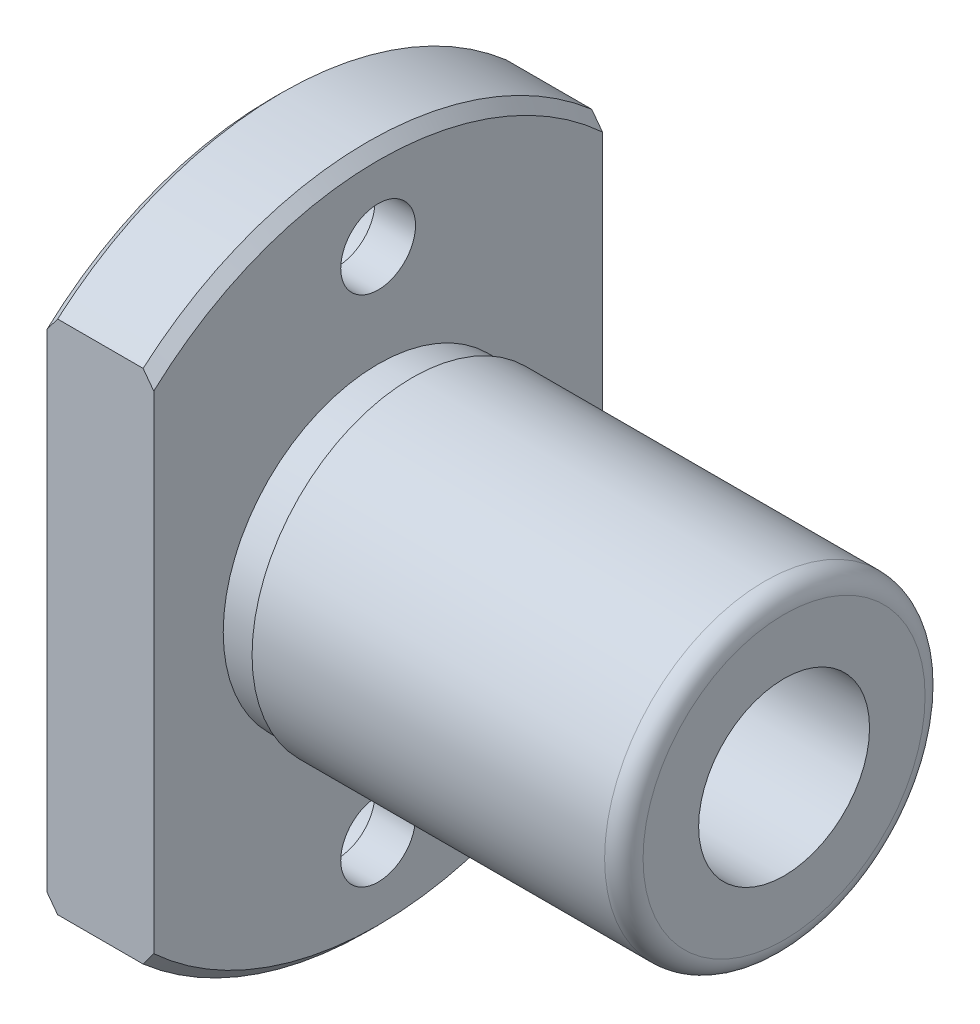
ISO-10303-21;
HEADER;
FILE_DESCRIPTION(('STEP AP214'),'2;1');
FILE_NAME('part.step','',(''),(''),'','','');
FILE_SCHEMA(('AUTOMOTIVE_DESIGN { 1 0 10303 214 1 1 1 1 }'));
ENDSEC;
DATA;
#1=APPLICATION_CONTEXT('core data for automotive mechanical design processes');
#2=APPLICATION_PROTOCOL_DEFINITION('international standard','automotive_design',2000,#1);
#3=PRODUCT_CONTEXT('',#1,'mechanical');
#4=PRODUCT('Part','Part','',(#3));
#5=PRODUCT_RELATED_PRODUCT_CATEGORY('part','',(#4));
#6=PRODUCT_DEFINITION_FORMATION('','',#4);
#7=PRODUCT_DEFINITION_CONTEXT('part definition',#1,'design');
#8=PRODUCT_DEFINITION('design','',#6,#7);
#9=PRODUCT_DEFINITION_SHAPE('','',#8);
#10=(LENGTH_UNIT() NAMED_UNIT(*) SI_UNIT(.MILLI.,.METRE.));
#11=(NAMED_UNIT(*) PLANE_ANGLE_UNIT() SI_UNIT($,.RADIAN.));
#12=(NAMED_UNIT(*) SI_UNIT($,.STERADIAN.) SOLID_ANGLE_UNIT());
#13=UNCERTAINTY_MEASURE_WITH_UNIT(LENGTH_MEASURE(1.E-05),#10,'distance_accuracy_value','');
#14=(GEOMETRIC_REPRESENTATION_CONTEXT(3) GLOBAL_UNCERTAINTY_ASSIGNED_CONTEXT((#13)) GLOBAL_UNIT_ASSIGNED_CONTEXT((#10,
#11,#12)) REPRESENTATION_CONTEXT('',''));
#15=CARTESIAN_POINT('',(0.,0.,0.));
#16=DIRECTION('',(0.,0.,1.));
#17=DIRECTION('',(1.,0.,0.));
#18=AXIS2_PLACEMENT_3D('',#15,#16,#17);
#19=CARTESIAN_POINT('',(4.50000000002017,0.,0.));
#20=DIRECTION('',(-1.,0.,0.));
#21=DIRECTION('',(0.,-0.735597048951348,-0.677419354295453));
#22=AXIS2_PLACEMENT_3D('',#19,#20,#21);
#23=CONICAL_SURFACE('',#22,15.9999999999798,0.785398163397446);
#24=CARTESIAN_POINT('',(4.99999998756977,-11.4017542678895,-10.5));
#25=CARTESIAN_POINT('',(4.83485881823746,-11.6262537644729,-10.5));
#26=CARTESIAN_POINT('',(4.66800625282314,-11.8500370074933,-10.5));
#27=CARTESIAN_POINT('',(4.50000000002689,-12.0726964676243,-10.5));
#28=B_SPLINE_CURVE_WITH_KNOTS('',3,(#24,#25,#26,#27),.UNSPECIFIED.,.F.,.F.,(4,4),(0.,1.),.UNSPECIFIED.);
#29=CARTESIAN_POINT('',(5.,-11.4017542587459,-10.4999999915795));
#30=VERTEX_POINT('',#29);
#31=CARTESIAN_POINT('',(4.50000000005547,-12.0726964675925,-10.4999999999811));
#32=VERTEX_POINT('',#31);
#33=EDGE_CURVE('E84',#30,#32,#28,.T.);
#34=ORIENTED_EDGE('',*,*,#33,.F.);
#35=CARTESIAN_POINT('',(5.,0.,0.));
#36=DIRECTION('',(-1.,0.,0.));
#37=DIRECTION('',(0.,-0.735597048951348,-0.677419354295453));
#38=AXIS2_PLACEMENT_3D('',#35,#36,#37);
#39=CIRCLE('',#38,15.5);
#40=CARTESIAN_POINT('',(5.,-11.4017542509914,10.5));
#41=VERTEX_POINT('',#40);
#42=EDGE_CURVE('E102',#41,#30,#39,.F.);
#43=ORIENTED_EDGE('',*,*,#42,.F.);
#44=CARTESIAN_POINT('',(4.50000000005551,-12.0726964675762,10.5));
#45=CARTESIAN_POINT('',(4.66801110892824,-11.8500305744023,10.5));
#46=CARTESIAN_POINT('',(4.83486331846093,-11.6262476497699,10.5));
#47=CARTESIAN_POINT('',(4.99999999999999,-11.4017542509914,10.5));
#48=B_SPLINE_CURVE_WITH_KNOTS('',3,(#44,#45,#46,#47),.UNSPECIFIED.,.F.,.F.,(4,4),(0.,1.),.UNSPECIFIED.);
#49=CARTESIAN_POINT('',(4.50000000005547,-12.0726964675762,10.4999999999999));
#50=VERTEX_POINT('',#49);
#51=EDGE_CURVE('E110',#50,#41,#48,.T.);
#52=ORIENTED_EDGE('',*,*,#51,.F.);
#53=CARTESIAN_POINT('',(4.50000000005547,0.,0.));
#54=DIRECTION('',(1.,0.,0.));
#55=DIRECTION('',(0.,-0.754543529226127,0.656250000002271));
#56=AXIS2_PLACEMENT_3D('',#53,#54,#55);
#57=CIRCLE('',#56,15.9999999999445);
#58=EDGE_CURVE('E104',#50,#32,#57,.T.);
#59=ORIENTED_EDGE('',*,*,#58,.T.);
#60=EDGE_LOOP('',(#34,#43,#52,#59));
#61=FACE_BOUND('',#60,.T.);
#62=ADVANCED_FACE('F17',(#61),#23,.T.);
#63=CARTESIAN_POINT('',(24.,0.,0.));
#64=DIRECTION('',(1.,0.,0.));
#65=DIRECTION('',(0.,-0.754543529226128,0.65625000000227));
#66=AXIS2_PLACEMENT_3D('',#63,#64,#65);
#67=CYLINDRICAL_SURFACE('',#66,16.);
#68=DIRECTION('',(1.,-2.61834998122889E-12,3.01003666430961E-12));
#69=VECTOR('',#68,1.);
#70=CARTESIAN_POINT('',(0.499999999954969,-12.0726964676239,-10.5000000000296));
#71=LINE('',#70,#69);
#72=CARTESIAN_POINT('',(0.499999999954969,-12.0726964676239,-10.5000000000296));
#73=VERTEX_POINT('',#72);
#74=EDGE_CURVE('E370',#32,#73,#71,.F.);
#75=ORIENTED_EDGE('',*,*,#74,.F.);
#76=ORIENTED_EDGE('',*,*,#58,.F.);
#77=DIRECTION('',(-1.,-7.06767977465531E-12,-8.12638845092161E-12));
#78=VECTOR('',#77,1.);
#79=CARTESIAN_POINT('',(4.50000000005551,-12.072696467618,10.5000000000363));
#80=LINE('',#79,#78);
#81=CARTESIAN_POINT('',(0.499999999994138,-12.0726964676463,10.5000000000038));
#82=VERTEX_POINT('',#81);
#83=EDGE_CURVE('E377',#50,#82,#80,.T.);
#84=ORIENTED_EDGE('',*,*,#83,.T.);
#85=CARTESIAN_POINT('',(0.499999999994138,0.,0.));
#86=DIRECTION('',(1.,0.,0.));
#87=DIRECTION('',(0.,-0.754543529227894,0.65625000000024));
#88=AXIS2_PLACEMENT_3D('',#85,#86,#87);
#89=CIRCLE('',#88,16.);
#90=EDGE_CURVE('E373',#82,#73,#89,.T.);
#91=ORIENTED_EDGE('',*,*,#90,.T.);
#92=EDGE_LOOP('',(#75,#76,#84,#91));
#93=FACE_BOUND('',#92,.T.);
#94=ADVANCED_FACE('F131',(#93),#67,.T.);
#95=CARTESIAN_POINT('',(0.499999999995601,0.,0.));
#96=DIRECTION('',(1.,0.,0.));
#97=DIRECTION('',(0.,-0.735597048951347,0.677419354295453));
#98=AXIS2_PLACEMENT_3D('',#95,#96,#97);
#99=CONICAL_SURFACE('',#98,15.9999999999956,0.785398163397449);
#100=CARTESIAN_POINT('',(0.49999999995497,-12.0726964676069,-10.5));
#101=CARTESIAN_POINT('',(0.331988891078524,-11.8500305744224,-10.5));
#102=CARTESIAN_POINT('',(0.165136681542717,-11.6262476497803,-10.5));
#103=CARTESIAN_POINT('',(0.,-11.4017542509914,-10.5));
#104=B_SPLINE_CURVE_WITH_KNOTS('',3,(#100,#101,#102,#103),.UNSPECIFIED.,.F.,.F.,(4,4),(0.,1.),.UNSPECIFIED.);
#105=CARTESIAN_POINT('',(0.,-11.4017542509914,-10.5));
#106=VERTEX_POINT('',#105);
#107=EDGE_CURVE('E361',#73,#106,#104,.T.);
#108=ORIENTED_EDGE('',*,*,#107,.F.);
#109=ORIENTED_EDGE('',*,*,#90,.F.);
#110=CARTESIAN_POINT('',(1.24302330581361E-08,-11.4017542678895,10.5));
#111=CARTESIAN_POINT('',(0.165141181769335,-11.6262537644793,10.5));
#112=CARTESIAN_POINT('',(0.331993747190985,-11.8500370075067,10.5));
#113=CARTESIAN_POINT('',(0.499999999994138,-12.0726964676441,10.5));
#114=B_SPLINE_CURVE_WITH_KNOTS('',3,(#110,#111,#112,#113),.UNSPECIFIED.,.F.,.F.,(4,4),(0.,1.),.UNSPECIFIED.);
#115=CARTESIAN_POINT('',(0.,-11.4017542587459,10.4999999915795));
#116=VERTEX_POINT('',#115);
#117=EDGE_CURVE('E163',#116,#82,#114,.T.);
#118=ORIENTED_EDGE('',*,*,#117,.F.);
#119=CARTESIAN_POINT('',(0.,0.,0.));
#120=DIRECTION('',(1.,0.,0.));
#121=DIRECTION('',(0.,-0.735597048951348,0.677419354295453));
#122=AXIS2_PLACEMENT_3D('',#119,#120,#121);
#123=CIRCLE('',#122,15.5);
#124=EDGE_CURVE('E154',#116,#106,#123,.T.);
#125=ORIENTED_EDGE('',*,*,#124,.T.);
#126=EDGE_LOOP('',(#108,#109,#118,#125));
#127=FACE_BOUND('',#126,.T.);
#128=ADVANCED_FACE('F135',(#127),#99,.T.);
#129=CARTESIAN_POINT('',(0.,-15.7406297060702,-10.5));
#130=DIRECTION('',(-1.,0.,0.));
#131=DIRECTION('',(0.,0.,1.));
#132=AXIS2_PLACEMENT_3D('',#129,#130,#131);
#133=PLANE('',#132);
#134=CARTESIAN_POINT('',(0.,0.,0.));
#135=DIRECTION('',(-1.,0.,0.));
#136=DIRECTION('',(0.,0.735597048451057,0.67741935483871));
#137=AXIS2_PLACEMENT_3D('',#134,#135,#136);
#138=CIRCLE('',#137,15.5);
#139=CARTESIAN_POINT('',(0.,11.4017542509914,-10.5));
#140=VERTEX_POINT('',#139);
#141=CARTESIAN_POINT('',(0.,11.4017542509914,10.5));
#142=VERTEX_POINT('',#141);
#143=EDGE_CURVE('E162',#140,#142,#138,.F.);
#144=ORIENTED_EDGE('',*,*,#143,.F.);
#145=DIRECTION('',(0.,-1.,0.));
#146=VECTOR('',#145,1.);
#147=CARTESIAN_POINT('',(0.,11.4017542509914,-10.5));
#148=LINE('',#147,#146);
#149=EDGE_CURVE('E168',#106,#140,#148,.F.);
#150=ORIENTED_EDGE('',*,*,#149,.F.);
#151=ORIENTED_EDGE('',*,*,#124,.F.);
#152=DIRECTION('',(0.,1.,0.));
#153=VECTOR('',#152,1.);
#154=CARTESIAN_POINT('',(0.,-11.4017542678895,10.5));
#155=LINE('',#154,#153);
#156=EDGE_CURVE('E172',#142,#116,#155,.F.);
#157=ORIENTED_EDGE('',*,*,#156,.F.);
#158=EDGE_LOOP('',(#144,#150,#151,#157));
#159=FACE_BOUND('',#158,.T.);
#160=CARTESIAN_POINT('',(0.,0.,0.));
#161=DIRECTION('',(1.,0.,0.));
#162=DIRECTION('',(0.,0.,1.));
#163=AXIS2_PLACEMENT_3D('',#160,#161,#162);
#164=CIRCLE('',#163,4.);
#165=CARTESIAN_POINT('',(0.,0.,4.));
#166=VERTEX_POINT('',#165);
#167=EDGE_CURVE('E176',#166,#166,#164,.T.);
#168=ORIENTED_EDGE('',*,*,#167,.T.);
#169=EDGE_LOOP('',(#168));
#170=FACE_BOUND('',#169,.T.);
#171=CARTESIAN_POINT('',(0.,-12.,0.));
#172=DIRECTION('',(1.,0.,0.));
#173=DIRECTION('',(0.,0.,1.));
#174=AXIS2_PLACEMENT_3D('',#171,#172,#173);
#175=CIRCLE('',#174,3.);
#176=CARTESIAN_POINT('',(0.,-12.,3.));
#177=VERTEX_POINT('',#176);
#178=EDGE_CURVE('E181',#177,#177,#175,.T.);
#179=ORIENTED_EDGE('',*,*,#178,.T.);
#180=EDGE_LOOP('',(#179));
#181=FACE_BOUND('',#180,.T.);
#182=CARTESIAN_POINT('',(0.,12.,0.));
#183=DIRECTION('',(1.,0.,0.));
#184=DIRECTION('',(0.,-1.42053899902334E-07,0.99999999999999));
#185=AXIS2_PLACEMENT_3D('',#182,#183,#184);
#186=CIRCLE('',#185,3.);
#187=CARTESIAN_POINT('',(0.,11.9999995738383,2.99999999999997));
#188=VERTEX_POINT('',#187);
#189=EDGE_CURVE('E184',#188,#188,#186,.T.);
#190=ORIENTED_EDGE('',*,*,#189,.T.);
#191=EDGE_LOOP('',(#190));
#192=FACE_BOUND('',#191,.T.);
#193=ADVANCED_FACE('F140',(#159,#170,#181,#192),#133,.T.);
#194=CARTESIAN_POINT('',(24.,-6.78033812054813,6.6));
#195=DIRECTION('',(1.,0.,0.));
#196=DIRECTION('',(0.,0.,-1.));
#197=AXIS2_PLACEMENT_3D('',#194,#195,#196);
#198=PLANE('',#197);
#199=CARTESIAN_POINT('',(24.,0.,0.));
#200=DIRECTION('',(1.,0.,0.));
#201=DIRECTION('',(0.,0.,1.));
#202=AXIS2_PLACEMENT_3D('',#199,#200,#201);
#203=CIRCLE('',#202,6.6);
#204=CARTESIAN_POINT('',(24.,0.,6.6));
#205=VERTEX_POINT('',#204);
#206=EDGE_CURVE('E187',#205,#205,#203,.T.);
#207=ORIENTED_EDGE('',*,*,#206,.T.);
#208=EDGE_LOOP('',(#207));
#209=FACE_BOUND('',#208,.T.);
#210=CARTESIAN_POINT('',(24.,0.,0.));
#211=DIRECTION('',(-1.,0.,0.));
#212=DIRECTION('',(0.,0.,-1.));
#213=AXIS2_PLACEMENT_3D('',#210,#211,#212);
#214=CIRCLE('',#213,4.);
#215=CARTESIAN_POINT('',(24.,0.,-4.));
#216=VERTEX_POINT('',#215);
#217=EDGE_CURVE('E190',#216,#216,#214,.F.);
#218=ORIENTED_EDGE('',*,*,#217,.F.);
#219=EDGE_LOOP('',(#218));
#220=FACE_BOUND('',#219,.T.);
#221=ADVANCED_FACE('F534',(#209,#220),#198,.T.);
#222=CARTESIAN_POINT('',(6.6,-7.70492968244106,-7.5));
#223=DIRECTION('',(-1.,0.,0.));
#224=DIRECTION('',(0.,0.,1.));
#225=AXIS2_PLACEMENT_3D('',#222,#223,#224);
#226=PLANE('',#225);
#227=CARTESIAN_POINT('',(6.6,0.,0.));
#228=DIRECTION('',(-1.,0.,0.));
#229=DIRECTION('',(0.,0.,-1.));
#230=AXIS2_PLACEMENT_3D('',#227,#228,#229);
#231=CIRCLE('',#230,7.5);
#232=CARTESIAN_POINT('',(6.6,0.,-7.5));
#233=VERTEX_POINT('',#232);
#234=EDGE_CURVE('E193',#233,#233,#231,.F.);
#235=ORIENTED_EDGE('',*,*,#234,.F.);
#236=EDGE_LOOP('',(#235));
#237=FACE_BOUND('',#236,.T.);
#238=CARTESIAN_POINT('',(6.6,0.,0.));
#239=DIRECTION('',(1.,0.,0.));
#240=DIRECTION('',(0.,-1.16854559745003E-09,1.));
#241=AXIS2_PLACEMENT_3D('',#238,#239,#240);
#242=CIRCLE('',#241,7.25);
#243=CARTESIAN_POINT('',(6.6,-8.4719555815127E-09,7.25));
#244=VERTEX_POINT('',#243);
#245=EDGE_CURVE('E95',#244,#244,#242,.T.);
#246=ORIENTED_EDGE('',*,*,#245,.T.);
#247=EDGE_LOOP('',(#246));
#248=FACE_BOUND('',#247,.T.);
#249=ADVANCED_FACE('F527',(#237,#248),#226,.T.);
#250=CARTESIAN_POINT('',(5.,-15.7406297060702,10.5));
#251=DIRECTION('',(1.,0.,0.));
#252=DIRECTION('',(0.,0.,-1.));
#253=AXIS2_PLACEMENT_3D('',#250,#251,#252);
#254=PLANE('',#253);
#255=DIRECTION('',(0.,1.,0.));
#256=VECTOR('',#255,1.);
#257=CARTESIAN_POINT('',(5.,-11.4017542678895,-10.5));
#258=LINE('',#257,#256);
#259=CARTESIAN_POINT('',(5.,11.4017542509914,-10.5));
#260=VERTEX_POINT('',#259);
#261=EDGE_CURVE('E81',#30,#260,#258,.T.);
#262=ORIENTED_EDGE('',*,*,#261,.T.);
#263=CARTESIAN_POINT('',(5.,0.,0.));
#264=DIRECTION('',(1.,0.,0.));
#265=DIRECTION('',(0.,0.735597048451057,-0.67741935483871));
#266=AXIS2_PLACEMENT_3D('',#263,#264,#265);
#267=CIRCLE('',#266,15.5);
#268=CARTESIAN_POINT('',(5.,11.4017542587459,10.4999999915795));
#269=VERTEX_POINT('',#268);
#270=EDGE_CURVE('E94',#260,#269,#267,.T.);
#271=ORIENTED_EDGE('',*,*,#270,.T.);
#272=DIRECTION('',(0.,-1.,0.));
#273=VECTOR('',#272,1.);
#274=CARTESIAN_POINT('',(5.,11.4017542678895,10.5));
#275=LINE('',#274,#273);
#276=EDGE_CURVE('E109',#269,#41,#275,.T.);
#277=ORIENTED_EDGE('',*,*,#276,.T.);
#278=ORIENTED_EDGE('',*,*,#42,.T.);
#279=EDGE_LOOP('',(#262,#271,#277,#278));
#280=FACE_BOUND('',#279,.T.);
#281=CARTESIAN_POINT('',(5.,0.,0.));
#282=DIRECTION('',(-1.,0.,0.));
#283=DIRECTION('',(0.,0.,-1.));
#284=AXIS2_PLACEMENT_3D('',#281,#282,#283);
#285=CIRCLE('',#284,7.25);
#286=CARTESIAN_POINT('',(5.,0.,-7.25));
#287=VERTEX_POINT('',#286);
#288=EDGE_CURVE('E204',#287,#287,#285,.F.);
#289=ORIENTED_EDGE('',*,*,#288,.F.);
#290=EDGE_LOOP('',(#289));
#291=FACE_BOUND('',#290,.T.);
#292=CARTESIAN_POINT('',(5.,-12.,0.));
#293=DIRECTION('',(-1.,0.,0.));
#294=DIRECTION('',(0.,0.,-1.));
#295=AXIS2_PLACEMENT_3D('',#292,#293,#294);
#296=CIRCLE('',#295,1.75);
#297=CARTESIAN_POINT('',(5.,-12.,-1.75));
#298=VERTEX_POINT('',#297);
#299=EDGE_CURVE('E209',#298,#298,#296,.F.);
#300=ORIENTED_EDGE('',*,*,#299,.F.);
#301=EDGE_LOOP('',(#300));
#302=FACE_BOUND('',#301,.T.);
#303=CARTESIAN_POINT('',(5.,12.,0.));
#304=DIRECTION('',(-1.,0.,0.));
#305=DIRECTION('',(0.,0.,-1.));
#306=AXIS2_PLACEMENT_3D('',#303,#304,#305);
#307=CIRCLE('',#306,1.75);
#308=CARTESIAN_POINT('',(5.,12.,-1.75));
#309=VERTEX_POINT('',#308);
#310=EDGE_CURVE('E212',#309,#309,#307,.T.);
#311=ORIENTED_EDGE('',*,*,#310,.T.);
#312=EDGE_LOOP('',(#311));
#313=FACE_BOUND('',#312,.T.);
#314=ADVANCED_FACE('F107',(#280,#291,#302,#313),#254,.T.);
#315=CARTESIAN_POINT('',(4.50000000002016,0.,0.));
#316=DIRECTION('',(-1.,0.,0.));
#317=DIRECTION('',(0.,0.735597048951348,0.677419354295453));
#318=AXIS2_PLACEMENT_3D('',#315,#316,#317);
#319=CONICAL_SURFACE('',#318,15.9999999999798,0.785398163397447);
#320=CARTESIAN_POINT('',(4.99999999378488,11.4017542678895,10.5));
#321=CARTESIAN_POINT('',(4.83485882239782,11.6262537644731,10.5));
#322=CARTESIAN_POINT('',(4.66800625490974,11.8500370074932,10.5));
#323=CARTESIAN_POINT('',(4.50000000002689,12.0726964676243,10.5));
#324=B_SPLINE_CURVE_WITH_KNOTS('',3,(#320,#321,#322,#323),.UNSPECIFIED.,.F.,.F.,(4,4),(0.,1.),.UNSPECIFIED.);
#325=CARTESIAN_POINT('',(4.50000000005548,12.0726964675925,10.4999999999811));
#326=VERTEX_POINT('',#325);
#327=EDGE_CURVE('E215',#269,#326,#324,.T.);
#328=ORIENTED_EDGE('',*,*,#327,.F.);
#329=ORIENTED_EDGE('',*,*,#270,.F.);
#330=CARTESIAN_POINT('',(4.50000000005551,12.0726964675762,-10.5));
#331=CARTESIAN_POINT('',(4.66801110892834,11.8500305744021,-10.5));
#332=CARTESIAN_POINT('',(4.83486331846084,11.62624764977,-10.5));
#333=CARTESIAN_POINT('',(5.,11.4017542509914,-10.5));
#334=B_SPLINE_CURVE_WITH_KNOTS('',3,(#330,#331,#332,#333),.UNSPECIFIED.,.F.,.F.,(4,4),(0.,1.),.UNSPECIFIED.);
#335=CARTESIAN_POINT('',(4.50000000005548,12.0726964675762,-10.4999999999999));
#336=VERTEX_POINT('',#335);
#337=EDGE_CURVE('E88',#336,#260,#334,.T.);
#338=ORIENTED_EDGE('',*,*,#337,.F.);
#339=CARTESIAN_POINT('',(4.50000000005548,0.,0.));
#340=DIRECTION('',(1.,0.,0.));
#341=DIRECTION('',(0.,0.754543529226127,-0.656250000002271));
#342=AXIS2_PLACEMENT_3D('',#339,#340,#341);
#343=CIRCLE('',#342,15.9999999999445);
#344=EDGE_CURVE('E242',#336,#326,#343,.T.);
#345=ORIENTED_EDGE('',*,*,#344,.T.);
#346=EDGE_LOOP('',(#328,#329,#338,#345));
#347=FACE_BOUND('',#346,.T.);
#348=ADVANCED_FACE('F225',(#347),#319,.T.);
#349=CARTESIAN_POINT('',(24.,0.,0.));
#350=DIRECTION('',(1.,0.,0.));
#351=DIRECTION('',(0.,0.754543529226128,-0.656250000002271));
#352=AXIS2_PLACEMENT_3D('',#349,#350,#351);
#353=CYLINDRICAL_SURFACE('',#352,16.);
#354=DIRECTION('',(-1.,7.06856795307499E-12,8.12772071855113E-12));
#355=VECTOR('',#354,1.);
#356=CARTESIAN_POINT('',(4.50000000005551,12.072696467618,-10.5000000000363));
#357=LINE('',#356,#355);
#358=CARTESIAN_POINT('',(0.499999999994138,12.0726964676463,-10.5000000000038));
#359=VERTEX_POINT('',#358);
#360=EDGE_CURVE('E249',#336,#359,#357,.T.);
#361=ORIENTED_EDGE('',*,*,#360,.T.);
#362=CARTESIAN_POINT('',(0.499999999994138,0.,0.));
#363=DIRECTION('',(1.,0.,0.));
#364=DIRECTION('',(0.,0.754543529227894,-0.656250000000239));
#365=AXIS2_PLACEMENT_3D('',#362,#363,#364);
#366=CIRCLE('',#365,16.);
#367=CARTESIAN_POINT('',(0.499999999994138,12.0726964676239,10.5000000000296));
#368=VERTEX_POINT('',#367);
#369=EDGE_CURVE('E253',#359,#368,#366,.T.);
#370=ORIENTED_EDGE('',*,*,#369,.T.);
#371=DIRECTION('',(1.,2.62989630068464E-12,-3.02380342981454E-12));
#372=VECTOR('',#371,1.);
#373=CARTESIAN_POINT('',(0.499999999954746,12.0726964676239,10.5000000000296));
#374=LINE('',#373,#372);
#375=EDGE_CURVE('E32',#326,#368,#374,.F.);
#376=ORIENTED_EDGE('',*,*,#375,.F.);
#377=ORIENTED_EDGE('',*,*,#344,.F.);
#378=EDGE_LOOP('',(#361,#370,#376,#377));
#379=FACE_BOUND('',#378,.T.);
#380=ADVANCED_FACE('F235',(#379),#353,.T.);
#381=CARTESIAN_POINT('',(0.499999999995601,0.,0.));
#382=DIRECTION('',(1.,0.,0.));
#383=DIRECTION('',(0.,0.735597048451057,-0.67741935483871));
#384=AXIS2_PLACEMENT_3D('',#381,#382,#383);
#385=CONICAL_SURFACE('',#384,15.9999999999956,0.785398163397449);
#386=CARTESIAN_POINT('',(0.,11.4017542509914,-10.5));
#387=CARTESIAN_POINT('',(0.165141173448593,11.6262537531677,-10.5));
#388=CARTESIAN_POINT('',(0.331993743017825,11.8500370018335,-10.5));
#389=CARTESIAN_POINT('',(0.499999999994138,12.0726964676441,-10.5));
#390=B_SPLINE_CURVE_WITH_KNOTS('',3,(#386,#387,#388,#389),.UNSPECIFIED.,.F.,.F.,(4,4),(0.,1.),.UNSPECIFIED.);
#391=EDGE_CURVE('E40',#140,#359,#390,.T.);
#392=ORIENTED_EDGE('',*,*,#391,.F.);
#393=ORIENTED_EDGE('',*,*,#143,.T.);
#394=CARTESIAN_POINT('',(0.499999999954744,12.0726964676068,10.5));
#395=CARTESIAN_POINT('',(0.331988891078985,11.8500305744232,10.5));
#396=CARTESIAN_POINT('',(0.165136681542036,11.6262476497794,10.5));
#397=CARTESIAN_POINT('',(0.,11.4017542509914,10.5));
#398=B_SPLINE_CURVE_WITH_KNOTS('',3,(#394,#395,#396,#397),.UNSPECIFIED.,.F.,.F.,(4,4),(0.,1.),.UNSPECIFIED.);
#399=EDGE_CURVE('E311',#368,#142,#398,.T.);
#400=ORIENTED_EDGE('',*,*,#399,.F.);
#401=ORIENTED_EDGE('',*,*,#369,.F.);
#402=EDGE_LOOP('',(#392,#393,#400,#401));
#403=FACE_BOUND('',#402,.T.);
#404=ADVANCED_FACE('F271',(#403),#385,.T.);
#405=CARTESIAN_POINT('',(5.,-12.07269646765,10.5));
#406=DIRECTION('',(0.,0.,1.));
#407=DIRECTION('',(0.,1.,0.));
#408=AXIS2_PLACEMENT_3D('',#405,#406,#407);
#409=PLANE('',#408);
#410=ORIENTED_EDGE('',*,*,#51,.T.);
#411=ORIENTED_EDGE('',*,*,#276,.F.);
#412=ORIENTED_EDGE('',*,*,#327,.T.);
#413=ORIENTED_EDGE('',*,*,#375,.T.);
#414=ORIENTED_EDGE('',*,*,#399,.T.);
#415=ORIENTED_EDGE('',*,*,#156,.T.);
#416=ORIENTED_EDGE('',*,*,#117,.T.);
#417=ORIENTED_EDGE('',*,*,#83,.F.);
#418=EDGE_LOOP('',(#410,#411,#412,#413,#414,#415,#416,#417));
#419=FACE_BOUND('',#418,.T.);
#420=ADVANCED_FACE('F280',(#419),#409,.T.);
#421=CARTESIAN_POINT('',(0.,-12.07269646765,-10.5));
#422=DIRECTION('',(0.,0.,-1.));
#423=DIRECTION('',(0.,1.,0.));
#424=AXIS2_PLACEMENT_3D('',#421,#422,#423);
#425=PLANE('',#424);
#426=ORIENTED_EDGE('',*,*,#337,.T.);
#427=ORIENTED_EDGE('',*,*,#261,.F.);
#428=ORIENTED_EDGE('',*,*,#33,.T.);
#429=ORIENTED_EDGE('',*,*,#74,.T.);
#430=ORIENTED_EDGE('',*,*,#107,.T.);
#431=ORIENTED_EDGE('',*,*,#149,.T.);
#432=ORIENTED_EDGE('',*,*,#391,.T.);
#433=ORIENTED_EDGE('',*,*,#360,.F.);
#434=EDGE_LOOP('',(#426,#427,#428,#429,#430,#431,#432,#433));
#435=FACE_BOUND('',#434,.T.);
#436=ADVANCED_FACE('F83',(#435),#425,.T.);
#437=CARTESIAN_POINT('',(3.1,9.,-3.));
#438=DIRECTION('',(-1.,0.,0.));
#439=DIRECTION('',(0.,0.,1.));
#440=AXIS2_PLACEMENT_3D('',#437,#438,#439);
#441=PLANE('',#440);
#442=CARTESIAN_POINT('',(3.1,12.,0.));
#443=DIRECTION('',(-1.,0.,0.));
#444=DIRECTION('',(0.,0.,-1.));
#445=AXIS2_PLACEMENT_3D('',#442,#443,#444);
#446=CIRCLE('',#445,3.);
#447=CARTESIAN_POINT('',(3.1,12.,-3.));
#448=VERTEX_POINT('',#447);
#449=EDGE_CURVE('E592',#448,#448,#446,.F.);
#450=ORIENTED_EDGE('',*,*,#449,.F.);
#451=EDGE_LOOP('',(#450));
#452=FACE_BOUND('',#451,.T.);
#453=CARTESIAN_POINT('',(3.1,12.,0.));
#454=DIRECTION('',(1.,0.,0.));
#455=DIRECTION('',(0.,0.,1.));
#456=AXIS2_PLACEMENT_3D('',#453,#454,#455);
#457=CIRCLE('',#456,1.75);
#458=CARTESIAN_POINT('',(3.1,12.,1.75));
#459=VERTEX_POINT('',#458);
#460=EDGE_CURVE('E594',#459,#459,#457,.T.);
#461=ORIENTED_EDGE('',*,*,#460,.T.);
#462=EDGE_LOOP('',(#461));
#463=FACE_BOUND('',#462,.T.);
#464=ADVANCED_FACE('F342',(#452,#463),#441,.T.);
#465=CARTESIAN_POINT('',(3.1,-15.,-3.));
#466=DIRECTION('',(-1.,0.,0.));
#467=DIRECTION('',(0.,0.,1.));
#468=AXIS2_PLACEMENT_3D('',#465,#466,#467);
#469=PLANE('',#468);
#470=CARTESIAN_POINT('',(3.1,-12.,0.));
#471=DIRECTION('',(-1.,0.,0.));
#472=DIRECTION('',(0.,0.,-1.));
#473=AXIS2_PLACEMENT_3D('',#470,#471,#472);
#474=CIRCLE('',#473,3.);
#475=CARTESIAN_POINT('',(3.1,-12.,-3.));
#476=VERTEX_POINT('',#475);
#477=EDGE_CURVE('E597',#476,#476,#474,.F.);
#478=ORIENTED_EDGE('',*,*,#477,.F.);
#479=EDGE_LOOP('',(#478));
#480=FACE_BOUND('',#479,.T.);
#481=CARTESIAN_POINT('',(3.1,-12.,0.));
#482=DIRECTION('',(1.,0.,0.));
#483=DIRECTION('',(0.,0.,1.));
#484=AXIS2_PLACEMENT_3D('',#481,#482,#483);
#485=CIRCLE('',#484,1.75);
#486=CARTESIAN_POINT('',(3.1,-12.,1.75));
#487=VERTEX_POINT('',#486);
#488=EDGE_CURVE('E25',#487,#487,#485,.T.);
#489=ORIENTED_EDGE('',*,*,#488,.T.);
#490=EDGE_LOOP('',(#489));
#491=FACE_BOUND('',#490,.T.);
#492=ADVANCED_FACE('F408',(#480,#491),#469,.T.);
#493=CARTESIAN_POINT('',(24.,0.,0.));
#494=DIRECTION('',(1.,0.,0.));
#495=DIRECTION('',(0.,1.42053899876766E-07,0.99999999999999));
#496=AXIS2_PLACEMENT_3D('',#493,#494,#495);
#497=CYLINDRICAL_SURFACE('',#496,4.);
#498=ORIENTED_EDGE('',*,*,#217,.T.);
#499=EDGE_LOOP('',(#498));
#500=FACE_BOUND('',#499,.T.);
#501=ORIENTED_EDGE('',*,*,#167,.F.);
#502=EDGE_LOOP('',(#501));
#503=FACE_BOUND('',#502,.T.);
#504=ADVANCED_FACE('F415',(#500,#503),#497,.F.);
#505=CARTESIAN_POINT('',(23.1,0.,0.));
#506=DIRECTION('',(1.,0.,0.));
#507=DIRECTION('',(0.,0.,1.));
#508=AXIS2_PLACEMENT_3D('',#505,#506,#507);
#509=TOROIDAL_SURFACE('',#508,6.60000000000019,0.899999999999807);
#510=CARTESIAN_POINT('',(23.1,0.,0.));
#511=DIRECTION('',(1.,0.,0.));
#512=DIRECTION('',(0.,0.,1.));
#513=AXIS2_PLACEMENT_3D('',#510,#511,#512);
#514=CIRCLE('',#513,7.5);
#515=CARTESIAN_POINT('',(23.1,0.,7.5));
#516=VERTEX_POINT('',#515);
#517=EDGE_CURVE('E11',#516,#516,#514,.T.);
#518=ORIENTED_EDGE('',*,*,#517,.T.);
#519=EDGE_LOOP('',(#518));
#520=FACE_BOUND('',#519,.T.);
#521=ORIENTED_EDGE('',*,*,#206,.F.);
#522=EDGE_LOOP('',(#521));
#523=FACE_BOUND('',#522,.T.);
#524=ADVANCED_FACE('F422',(#520,#523),#509,.T.);
#525=CARTESIAN_POINT('',(24.,0.,0.));
#526=DIRECTION('',(1.,0.,0.));
#527=DIRECTION('',(0.,0.,1.));
#528=AXIS2_PLACEMENT_3D('',#525,#526,#527);
#529=CYLINDRICAL_SURFACE('',#528,7.5);
#530=ORIENTED_EDGE('',*,*,#234,.T.);
#531=EDGE_LOOP('',(#530));
#532=FACE_BOUND('',#531,.T.);
#533=ORIENTED_EDGE('',*,*,#517,.F.);
#534=EDGE_LOOP('',(#533));
#535=FACE_BOUND('',#534,.T.);
#536=ADVANCED_FACE('F430',(#532,#535),#529,.T.);
#537=CARTESIAN_POINT('',(24.,0.,0.));
#538=DIRECTION('',(1.,0.,0.));
#539=DIRECTION('',(0.,0.,1.));
#540=AXIS2_PLACEMENT_3D('',#537,#538,#539);
#541=CYLINDRICAL_SURFACE('',#540,7.25);
#542=ORIENTED_EDGE('',*,*,#288,.T.);
#543=EDGE_LOOP('',(#542));
#544=FACE_BOUND('',#543,.T.);
#545=ORIENTED_EDGE('',*,*,#245,.F.);
#546=EDGE_LOOP('',(#545));
#547=FACE_BOUND('',#546,.T.);
#548=ADVANCED_FACE('F438',(#544,#547),#541,.T.);
#549=CARTESIAN_POINT('',(5.,12.,0.));
#550=DIRECTION('',(1.,0.,0.));
#551=DIRECTION('',(0.,0.,1.));
#552=AXIS2_PLACEMENT_3D('',#549,#550,#551);
#553=CYLINDRICAL_SURFACE('',#552,3.);
#554=ORIENTED_EDGE('',*,*,#449,.T.);
#555=EDGE_LOOP('',(#554));
#556=FACE_BOUND('',#555,.T.);
#557=ORIENTED_EDGE('',*,*,#189,.F.);
#558=EDGE_LOOP('',(#557));
#559=FACE_BOUND('',#558,.T.);
#560=ADVANCED_FACE('F446',(#556,#559),#553,.F.);
#561=CARTESIAN_POINT('',(5.,12.,0.));
#562=DIRECTION('',(1.,0.,0.));
#563=DIRECTION('',(0.,1.4205390875855E-07,0.99999999999999));
#564=AXIS2_PLACEMENT_3D('',#561,#562,#563);
#565=CYLINDRICAL_SURFACE('',#564,1.75);
#566=ORIENTED_EDGE('',*,*,#310,.F.);
#567=EDGE_LOOP('',(#566));
#568=FACE_BOUND('',#567,.T.);
#569=ORIENTED_EDGE('',*,*,#460,.F.);
#570=EDGE_LOOP('',(#569));
#571=FACE_BOUND('',#570,.T.);
#572=ADVANCED_FACE('F454',(#568,#571),#565,.F.);
#573=CARTESIAN_POINT('',(5.,-12.,0.));
#574=DIRECTION('',(1.,0.,0.));
#575=DIRECTION('',(0.,0.,1.));
#576=AXIS2_PLACEMENT_3D('',#573,#574,#575);
#577=CYLINDRICAL_SURFACE('',#576,3.);
#578=ORIENTED_EDGE('',*,*,#477,.T.);
#579=EDGE_LOOP('',(#578));
#580=FACE_BOUND('',#579,.T.);
#581=ORIENTED_EDGE('',*,*,#178,.F.);
#582=EDGE_LOOP('',(#581));
#583=FACE_BOUND('',#582,.T.);
#584=ADVANCED_FACE('F462',(#580,#583),#577,.F.);
#585=CARTESIAN_POINT('',(5.,-12.,0.));
#586=DIRECTION('',(1.,0.,0.));
#587=DIRECTION('',(0.,1.42053894547696E-07,0.99999999999999));
#588=AXIS2_PLACEMENT_3D('',#585,#586,#587);
#589=CYLINDRICAL_SURFACE('',#588,1.75);
#590=ORIENTED_EDGE('',*,*,#299,.T.);
#591=EDGE_LOOP('',(#590));
#592=FACE_BOUND('',#591,.T.);
#593=ORIENTED_EDGE('',*,*,#488,.F.);
#594=EDGE_LOOP('',(#593));
#595=FACE_BOUND('',#594,.T.);
#596=ADVANCED_FACE('F19',(#592,#595),#589,.F.);
#597=CLOSED_SHELL('',(#62,#94,#128,#193,#221,#249,#314,#348,#380,#404,#420,#436,#464,#492,#504,
#524,#536,#548,#560,#572,#584,#596));
#598=MANIFOLD_SOLID_BREP('B1',#597);
#599=ADVANCED_BREP_SHAPE_REPRESENTATION('',(#18,#598),#14);
#600=SHAPE_DEFINITION_REPRESENTATION(#9,#599);
ENDSEC;
END-ISO-10303-21;
